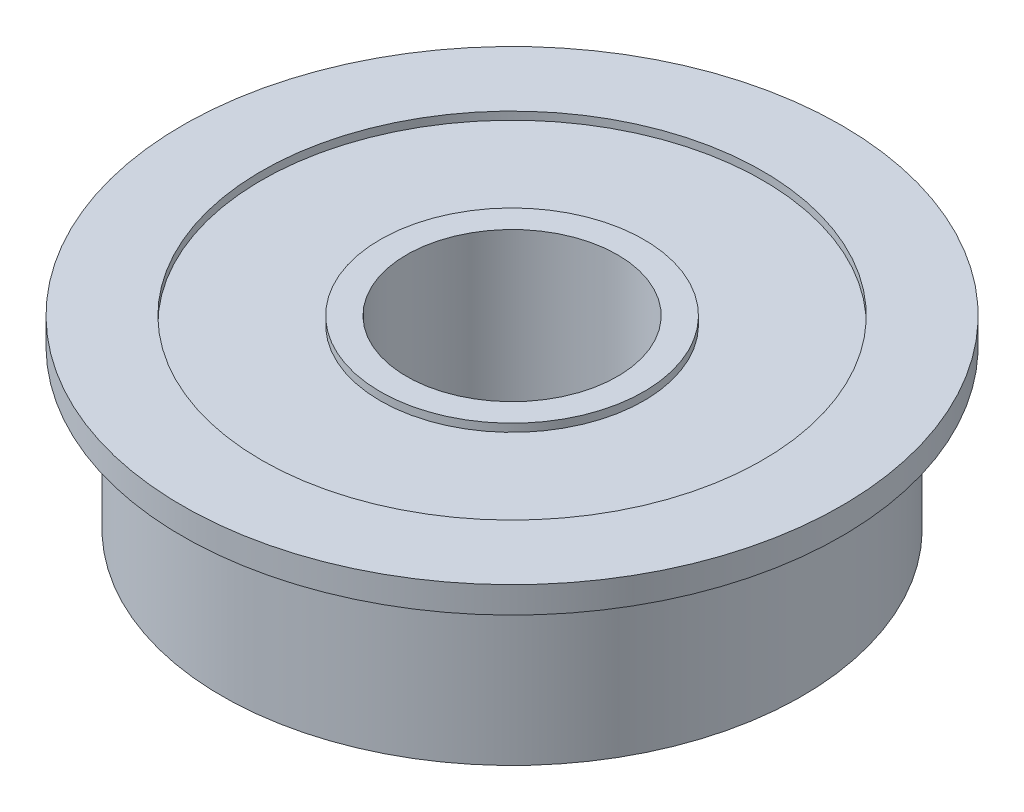
ISO-10303-21;
HEADER;
FILE_DESCRIPTION(('STEP AP214'),'2;1');
FILE_NAME('part.step','',(''),(''),'','','');
FILE_SCHEMA(('AUTOMOTIVE_DESIGN { 1 0 10303 214 1 1 1 1 }'));
ENDSEC;
DATA;
#1=APPLICATION_CONTEXT('core data for automotive mechanical design processes');
#2=APPLICATION_PROTOCOL_DEFINITION('international standard','automotive_design',2000,#1);
#3=PRODUCT_CONTEXT('',#1,'mechanical');
#4=PRODUCT('Part','Part','',(#3));
#5=PRODUCT_RELATED_PRODUCT_CATEGORY('part','',(#4));
#6=PRODUCT_DEFINITION_FORMATION('','',#4);
#7=PRODUCT_DEFINITION_CONTEXT('part definition',#1,'design');
#8=PRODUCT_DEFINITION('design','',#6,#7);
#9=PRODUCT_DEFINITION_SHAPE('','',#8);
#10=(LENGTH_UNIT() NAMED_UNIT(*) SI_UNIT(.MILLI.,.METRE.));
#11=(NAMED_UNIT(*) PLANE_ANGLE_UNIT() SI_UNIT($,.RADIAN.));
#12=(NAMED_UNIT(*) SI_UNIT($,.STERADIAN.) SOLID_ANGLE_UNIT());
#13=UNCERTAINTY_MEASURE_WITH_UNIT(LENGTH_MEASURE(1.E-05),#10,'distance_accuracy_value','');
#14=(GEOMETRIC_REPRESENTATION_CONTEXT(3) GLOBAL_UNCERTAINTY_ASSIGNED_CONTEXT((#13)) GLOBAL_UNIT_ASSIGNED_CONTEXT((#10,
#11,#12)) REPRESENTATION_CONTEXT('',''));
#15=CARTESIAN_POINT('',(0.,0.,0.));
#16=DIRECTION('',(0.,0.,1.));
#17=DIRECTION('',(1.,0.,0.));
#18=AXIS2_PLACEMENT_3D('',#15,#16,#17);
#19=CARTESIAN_POINT('',(-4.,0.,0.));
#20=DIRECTION('',(0.,1.,0.));
#21=DIRECTION('',(0.,0.,1.));
#22=AXIS2_PLACEMENT_3D('',#19,#20,#21);
#23=PLANE('',#22);
#24=CARTESIAN_POINT('',(0.,0.,0.));
#25=DIRECTION('',(0.,-1.,0.));
#26=DIRECTION('',(0.,0.,-1.));
#27=AXIS2_PLACEMENT_3D('',#24,#25,#26);
#28=CIRCLE('',#27,4.);
#29=CARTESIAN_POINT('',(0.,0.,-4.));
#30=VERTEX_POINT('',#29);
#31=EDGE_CURVE('E50',#30,#30,#28,.T.);
#32=ORIENTED_EDGE('',*,*,#31,.F.);
#33=EDGE_LOOP('',(#32));
#34=FACE_BOUND('',#33,.T.);
#35=CARTESIAN_POINT('',(0.,0.,0.));
#36=DIRECTION('',(0.,-1.,0.));
#37=DIRECTION('',(0.,0.,-1.));
#38=AXIS2_PLACEMENT_3D('',#35,#36,#37);
#39=CIRCLE('',#38,5.);
#40=CARTESIAN_POINT('',(0.,0.,-5.));
#41=VERTEX_POINT('',#40);
#42=EDGE_CURVE('E94',#41,#41,#39,.T.);
#43=ORIENTED_EDGE('',*,*,#42,.T.);
#44=EDGE_LOOP('',(#43));
#45=FACE_BOUND('',#44,.T.);
#46=ADVANCED_FACE('F37',(#34,#45),#23,.F.);
#47=CARTESIAN_POINT('',(-12.5,7.,0.));
#48=DIRECTION('',(0.,-1.,0.));
#49=DIRECTION('',(0.,0.,-1.));
#50=AXIS2_PLACEMENT_3D('',#47,#48,#49);
#51=PLANE('',#50);
#52=CARTESIAN_POINT('',(0.,7.,0.));
#53=DIRECTION('',(0.,-1.,0.));
#54=DIRECTION('',(0.,0.,-1.));
#55=AXIS2_PLACEMENT_3D('',#52,#53,#54);
#56=CIRCLE('',#55,4.);
#57=CARTESIAN_POINT('',(0.,7.,-4.));
#58=VERTEX_POINT('',#57);
#59=EDGE_CURVE('E45',#58,#58,#56,.T.);
#60=ORIENTED_EDGE('',*,*,#59,.T.);
#61=EDGE_LOOP('',(#60));
#62=FACE_BOUND('',#61,.T.);
#63=CARTESIAN_POINT('',(0.,7.,0.));
#64=DIRECTION('',(0.,1.,0.));
#65=DIRECTION('',(0.,0.,1.));
#66=AXIS2_PLACEMENT_3D('',#63,#64,#65);
#67=CIRCLE('',#66,5.);
#68=CARTESIAN_POINT('',(0.,7.,5.));
#69=VERTEX_POINT('',#68);
#70=EDGE_CURVE('E78',#69,#69,#67,.T.);
#71=ORIENTED_EDGE('',*,*,#70,.T.);
#72=EDGE_LOOP('',(#71));
#73=FACE_BOUND('',#72,.T.);
#74=ADVANCED_FACE('F140',(#62,#73),#51,.F.);
#75=CARTESIAN_POINT('',(0.,0.,0.));
#76=DIRECTION('',(0.,-1.,0.));
#77=DIRECTION('',(0.,0.,-1.));
#78=AXIS2_PLACEMENT_3D('',#75,#76,#77);
#79=CYLINDRICAL_SURFACE('',#78,12.5);
#80=CARTESIAN_POINT('',(0.,6.,0.));
#81=DIRECTION('',(0.,-1.,0.));
#82=DIRECTION('',(0.,0.,-1.));
#83=AXIS2_PLACEMENT_3D('',#80,#81,#82);
#84=CIRCLE('',#83,12.5);
#85=CARTESIAN_POINT('',(0.,6.,-12.5));
#86=VERTEX_POINT('',#85);
#87=EDGE_CURVE('E65',#86,#86,#84,.T.);
#88=ORIENTED_EDGE('',*,*,#87,.F.);
#89=EDGE_LOOP('',(#88));
#90=FACE_BOUND('',#89,.T.);
#91=CARTESIAN_POINT('',(0.,7.,0.));
#92=DIRECTION('',(0.,-1.,0.));
#93=DIRECTION('',(0.,0.,-1.));
#94=AXIS2_PLACEMENT_3D('',#91,#92,#93);
#95=CIRCLE('',#94,12.5);
#96=CARTESIAN_POINT('',(0.,7.,-12.5));
#97=VERTEX_POINT('',#96);
#98=EDGE_CURVE('E10',#97,#97,#95,.T.);
#99=ORIENTED_EDGE('',*,*,#98,.T.);
#100=EDGE_LOOP('',(#99));
#101=FACE_BOUND('',#100,.T.);
#102=ADVANCED_FACE('F39',(#90,#101),#79,.T.);
#103=CARTESIAN_POINT('',(0.,7.,0.));
#104=DIRECTION('',(0.,1.,0.));
#105=DIRECTION('',(0.,0.,1.));
#106=AXIS2_PLACEMENT_3D('',#103,#104,#105);
#107=CIRCLE('',#106,9.5);
#108=CARTESIAN_POINT('',(0.,7.,9.5));
#109=VERTEX_POINT('',#108);
#110=EDGE_CURVE('E70',#109,#109,#107,.T.);
#111=ORIENTED_EDGE('',*,*,#110,.F.);
#112=EDGE_LOOP('',(#111));
#113=FACE_BOUND('',#112,.T.);
#114=ORIENTED_EDGE('',*,*,#98,.F.);
#115=EDGE_LOOP('',(#114));
#116=FACE_BOUND('',#115,.T.);
#117=ADVANCED_FACE('F139',(#113,#116),#51,.F.);
#118=CARTESIAN_POINT('',(0.,0.,0.));
#119=DIRECTION('',(0.,-1.,0.));
#120=DIRECTION('',(0.,0.,-1.));
#121=AXIS2_PLACEMENT_3D('',#118,#119,#120);
#122=CYLINDRICAL_SURFACE('',#121,4.);
#123=ORIENTED_EDGE('',*,*,#59,.F.);
#124=EDGE_LOOP('',(#123));
#125=FACE_BOUND('',#124,.T.);
#126=ORIENTED_EDGE('',*,*,#31,.T.);
#127=EDGE_LOOP('',(#126));
#128=FACE_BOUND('',#127,.T.);
#129=ADVANCED_FACE('F122',(#125,#128),#122,.F.);
#130=CARTESIAN_POINT('',(0.,0.,0.));
#131=DIRECTION('',(0.,-1.,0.));
#132=DIRECTION('',(0.,0.,-1.));
#133=AXIS2_PLACEMENT_3D('',#130,#131,#132);
#134=CIRCLE('',#133,9.5);
#135=CARTESIAN_POINT('',(0.,0.,-9.5));
#136=VERTEX_POINT('',#135);
#137=EDGE_CURVE('E86',#136,#136,#134,.T.);
#138=ORIENTED_EDGE('',*,*,#137,.F.);
#139=EDGE_LOOP('',(#138));
#140=FACE_BOUND('',#139,.T.);
#141=CARTESIAN_POINT('',(0.,0.,0.));
#142=DIRECTION('',(0.,-1.,0.));
#143=DIRECTION('',(0.,0.,-1.));
#144=AXIS2_PLACEMENT_3D('',#141,#142,#143);
#145=CIRCLE('',#144,11.);
#146=CARTESIAN_POINT('',(0.,0.,-11.));
#147=VERTEX_POINT('',#146);
#148=EDGE_CURVE('E55',#147,#147,#145,.T.);
#149=ORIENTED_EDGE('',*,*,#148,.T.);
#150=EDGE_LOOP('',(#149));
#151=FACE_BOUND('',#150,.T.);
#152=ADVANCED_FACE('F118',(#140,#151),#23,.F.);
#153=CARTESIAN_POINT('',(0.,0.,0.));
#154=DIRECTION('',(0.,-1.,0.));
#155=DIRECTION('',(0.,0.,-1.));
#156=AXIS2_PLACEMENT_3D('',#153,#154,#155);
#157=CYLINDRICAL_SURFACE('',#156,11.);
#158=ORIENTED_EDGE('',*,*,#148,.F.);
#159=EDGE_LOOP('',(#158));
#160=FACE_BOUND('',#159,.T.);
#161=CARTESIAN_POINT('',(0.,6.,0.));
#162=DIRECTION('',(0.,-1.,0.));
#163=DIRECTION('',(0.,0.,-1.));
#164=AXIS2_PLACEMENT_3D('',#161,#162,#163);
#165=CIRCLE('',#164,11.);
#166=CARTESIAN_POINT('',(0.,6.,-11.));
#167=VERTEX_POINT('',#166);
#168=EDGE_CURVE('E61',#167,#167,#165,.T.);
#169=ORIENTED_EDGE('',*,*,#168,.T.);
#170=EDGE_LOOP('',(#169));
#171=FACE_BOUND('',#170,.T.);
#172=ADVANCED_FACE('F121',(#160,#171),#157,.T.);
#173=CARTESIAN_POINT('',(-11.,6.,0.));
#174=DIRECTION('',(0.,1.,0.));
#175=DIRECTION('',(0.,0.,1.));
#176=AXIS2_PLACEMENT_3D('',#173,#174,#175);
#177=PLANE('',#176);
#178=ORIENTED_EDGE('',*,*,#168,.F.);
#179=EDGE_LOOP('',(#178));
#180=FACE_BOUND('',#179,.T.);
#181=ORIENTED_EDGE('',*,*,#87,.T.);
#182=EDGE_LOOP('',(#181));
#183=FACE_BOUND('',#182,.T.);
#184=ADVANCED_FACE('F128',(#180,#183),#177,.F.);
#185=CARTESIAN_POINT('',(0.,6.7,0.));
#186=DIRECTION('',(0.,1.,0.));
#187=DIRECTION('',(0.,0.,1.));
#188=AXIS2_PLACEMENT_3D('',#185,#186,#187);
#189=CYLINDRICAL_SURFACE('',#188,9.5);
#190=CARTESIAN_POINT('',(0.,6.7,0.));
#191=DIRECTION('',(0.,1.,0.));
#192=DIRECTION('',(0.,0.,1.));
#193=AXIS2_PLACEMENT_3D('',#190,#191,#192);
#194=CIRCLE('',#193,9.5);
#195=CARTESIAN_POINT('',(0.,6.7,9.5));
#196=VERTEX_POINT('',#195);
#197=EDGE_CURVE('E69',#196,#196,#194,.T.);
#198=ORIENTED_EDGE('',*,*,#197,.F.);
#199=EDGE_LOOP('',(#198));
#200=FACE_BOUND('',#199,.T.);
#201=ORIENTED_EDGE('',*,*,#110,.T.);
#202=EDGE_LOOP('',(#201));
#203=FACE_BOUND('',#202,.T.);
#204=ADVANCED_FACE('F134',(#200,#203),#189,.F.);
#205=CARTESIAN_POINT('',(0.,6.7,0.));
#206=DIRECTION('',(0.,1.,0.));
#207=DIRECTION('',(0.,0.,1.));
#208=AXIS2_PLACEMENT_3D('',#205,#206,#207);
#209=PLANE('',#208);
#210=CARTESIAN_POINT('',(0.,6.7,0.));
#211=DIRECTION('',(0.,1.,0.));
#212=DIRECTION('',(0.,0.,1.));
#213=AXIS2_PLACEMENT_3D('',#210,#211,#212);
#214=CIRCLE('',#213,5.);
#215=CARTESIAN_POINT('',(0.,6.7,5.));
#216=VERTEX_POINT('',#215);
#217=EDGE_CURVE('E74',#216,#216,#214,.T.);
#218=ORIENTED_EDGE('',*,*,#217,.F.);
#219=EDGE_LOOP('',(#218));
#220=FACE_BOUND('',#219,.T.);
#221=ORIENTED_EDGE('',*,*,#197,.T.);
#222=EDGE_LOOP('',(#221));
#223=FACE_BOUND('',#222,.T.);
#224=ADVANCED_FACE('F180',(#220,#223),#209,.T.);
#225=CARTESIAN_POINT('',(0.,6.7,0.));
#226=DIRECTION('',(0.,1.,0.));
#227=DIRECTION('',(0.,0.,1.));
#228=AXIS2_PLACEMENT_3D('',#225,#226,#227);
#229=CYLINDRICAL_SURFACE('',#228,5.);
#230=ORIENTED_EDGE('',*,*,#217,.T.);
#231=EDGE_LOOP('',(#230));
#232=FACE_BOUND('',#231,.T.);
#233=ORIENTED_EDGE('',*,*,#70,.F.);
#234=EDGE_LOOP('',(#233));
#235=FACE_BOUND('',#234,.T.);
#236=ADVANCED_FACE('F114',(#232,#235),#229,.T.);
#237=CARTESIAN_POINT('',(0.,0.3,0.));
#238=DIRECTION('',(0.,-1.,0.));
#239=DIRECTION('',(0.,0.,-1.));
#240=AXIS2_PLACEMENT_3D('',#237,#238,#239);
#241=CYLINDRICAL_SURFACE('',#240,9.5);
#242=CARTESIAN_POINT('',(0.,0.3,0.));
#243=DIRECTION('',(0.,-1.,0.));
#244=DIRECTION('',(0.,0.,-1.));
#245=AXIS2_PLACEMENT_3D('',#242,#243,#244);
#246=CIRCLE('',#245,9.5);
#247=CARTESIAN_POINT('',(0.,0.3,-9.5));
#248=VERTEX_POINT('',#247);
#249=EDGE_CURVE('E82',#248,#248,#246,.T.);
#250=ORIENTED_EDGE('',*,*,#249,.F.);
#251=EDGE_LOOP('',(#250));
#252=FACE_BOUND('',#251,.T.);
#253=ORIENTED_EDGE('',*,*,#137,.T.);
#254=EDGE_LOOP('',(#253));
#255=FACE_BOUND('',#254,.T.);
#256=ADVANCED_FACE('F108',(#252,#255),#241,.F.);
#257=CARTESIAN_POINT('',(0.,0.3,0.));
#258=DIRECTION('',(0.,-1.,0.));
#259=DIRECTION('',(0.,0.,-1.));
#260=AXIS2_PLACEMENT_3D('',#257,#258,#259);
#261=PLANE('',#260);
#262=CARTESIAN_POINT('',(0.,0.3,0.));
#263=DIRECTION('',(0.,-1.,0.));
#264=DIRECTION('',(0.,0.,-1.));
#265=AXIS2_PLACEMENT_3D('',#262,#263,#264);
#266=CIRCLE('',#265,5.);
#267=CARTESIAN_POINT('',(0.,0.3,-5.));
#268=VERTEX_POINT('',#267);
#269=EDGE_CURVE('E90',#268,#268,#266,.T.);
#270=ORIENTED_EDGE('',*,*,#269,.F.);
#271=EDGE_LOOP('',(#270));
#272=FACE_BOUND('',#271,.T.);
#273=ORIENTED_EDGE('',*,*,#249,.T.);
#274=EDGE_LOOP('',(#273));
#275=FACE_BOUND('',#274,.T.);
#276=ADVANCED_FACE('F105',(#272,#275),#261,.T.);
#277=CARTESIAN_POINT('',(0.,0.3,0.));
#278=DIRECTION('',(0.,-1.,0.));
#279=DIRECTION('',(0.,0.,-1.));
#280=AXIS2_PLACEMENT_3D('',#277,#278,#279);
#281=CYLINDRICAL_SURFACE('',#280,5.);
#282=ORIENTED_EDGE('',*,*,#269,.T.);
#283=EDGE_LOOP('',(#282));
#284=FACE_BOUND('',#283,.T.);
#285=ORIENTED_EDGE('',*,*,#42,.F.);
#286=EDGE_LOOP('',(#285));
#287=FACE_BOUND('',#286,.T.);
#288=ADVANCED_FACE('F102',(#284,#287),#281,.T.);
#289=CLOSED_SHELL('',(#46,#74,#102,#117,#129,#152,#172,#184,#204,#224,#236,#256,#276,#288));
#290=MANIFOLD_SOLID_BREP('B2',#289);
#291=ADVANCED_BREP_SHAPE_REPRESENTATION('',(#18,#290),#14);
#292=SHAPE_DEFINITION_REPRESENTATION(#9,#291);
ENDSEC;
END-ISO-10303-21;
